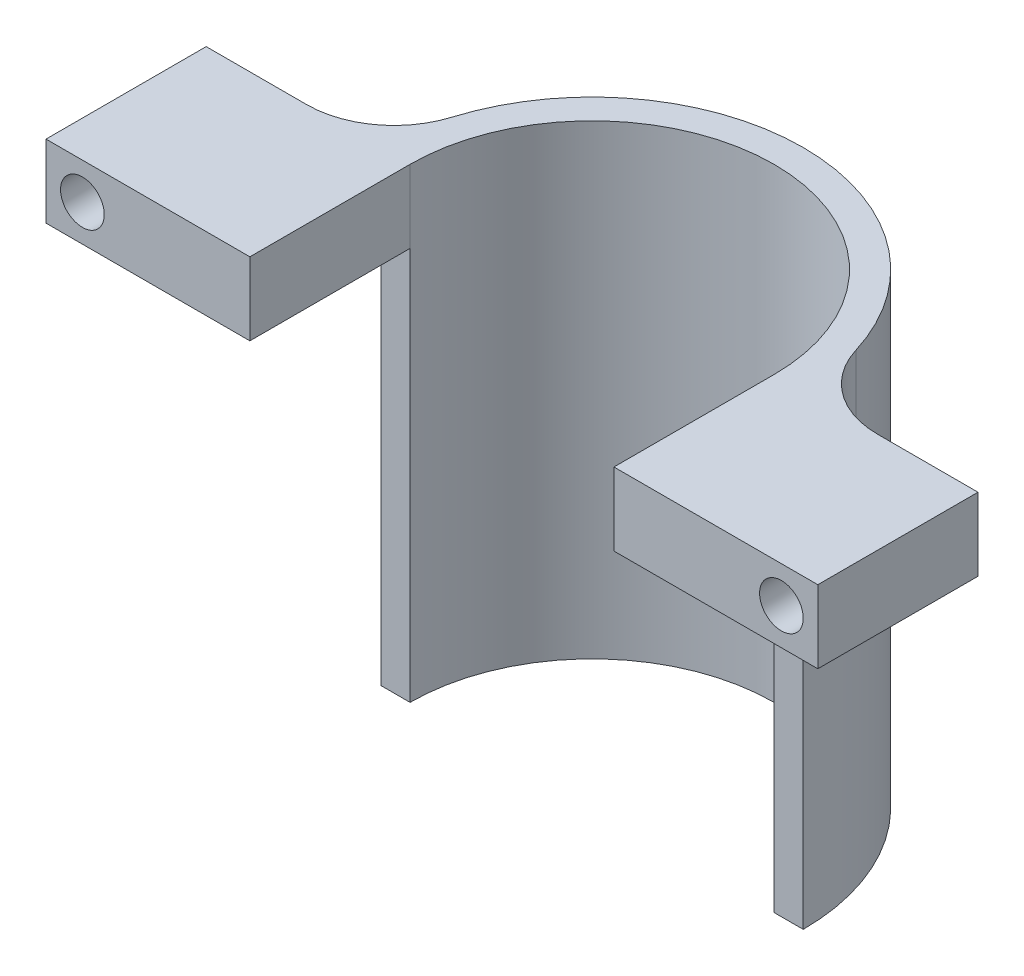
ISO-10303-21;
HEADER;
FILE_DESCRIPTION(('STEP AP214'),'2;1');
FILE_NAME('part.step','',(''),(''),'','','');
FILE_SCHEMA(('AUTOMOTIVE_DESIGN { 1 0 10303 214 1 1 1 1 }'));
ENDSEC;
DATA;
#1=APPLICATION_CONTEXT('core data for automotive mechanical design processes');
#2=APPLICATION_PROTOCOL_DEFINITION('international standard','automotive_design',2000,#1);
#3=PRODUCT_CONTEXT('',#1,'mechanical');
#4=PRODUCT('Part','Part','',(#3));
#5=PRODUCT_RELATED_PRODUCT_CATEGORY('part','',(#4));
#6=PRODUCT_DEFINITION_FORMATION('','',#4);
#7=PRODUCT_DEFINITION_CONTEXT('part definition',#1,'design');
#8=PRODUCT_DEFINITION('design','',#6,#7);
#9=PRODUCT_DEFINITION_SHAPE('','',#8);
#10=(LENGTH_UNIT() NAMED_UNIT(*) SI_UNIT(.MILLI.,.METRE.));
#11=(NAMED_UNIT(*) PLANE_ANGLE_UNIT() SI_UNIT($,.RADIAN.));
#12=(NAMED_UNIT(*) SI_UNIT($,.STERADIAN.) SOLID_ANGLE_UNIT());
#13=UNCERTAINTY_MEASURE_WITH_UNIT(LENGTH_MEASURE(1.E-05),#10,'distance_accuracy_value','');
#14=(GEOMETRIC_REPRESENTATION_CONTEXT(3) GLOBAL_UNCERTAINTY_ASSIGNED_CONTEXT((#13)) GLOBAL_UNIT_ASSIGNED_CONTEXT((#10,
#11,#12)) REPRESENTATION_CONTEXT('',''));
#15=CARTESIAN_POINT('',(0.,0.,0.));
#16=DIRECTION('',(0.,0.,1.));
#17=DIRECTION('',(1.,0.,0.));
#18=AXIS2_PLACEMENT_3D('',#15,#16,#17);
#19=CARTESIAN_POINT('',(12.5,32.,0.));
#20=DIRECTION('',(0.,0.,-1.));
#21=DIRECTION('',(-1.,0.,0.));
#22=AXIS2_PLACEMENT_3D('',#19,#20,#21);
#23=PLANE('',#22);
#24=DIRECTION('',(1.,0.,0.));
#25=VECTOR('',#24,1.);
#26=CARTESIAN_POINT('',(14.5,27.,0.));
#27=LINE('',#26,#25);
#28=CARTESIAN_POINT('',(12.5,27.,0.));
#29=VERTEX_POINT('',#28);
#30=CARTESIAN_POINT('',(14.5,27.,0.));
#31=VERTEX_POINT('',#30);
#32=EDGE_CURVE('E273',#29,#31,#27,.T.);
#33=ORIENTED_EDGE('',*,*,#32,.F.);
#34=DIRECTION('',(0.,-1.,0.));
#35=VECTOR('',#34,1.);
#36=CARTESIAN_POINT('',(12.5,32.,0.));
#37=LINE('',#36,#35);
#38=CARTESIAN_POINT('',(12.5,0.,0.));
#39=VERTEX_POINT('',#38);
#40=EDGE_CURVE('E223',#29,#39,#37,.T.);
#41=ORIENTED_EDGE('',*,*,#40,.T.);
#42=DIRECTION('',(1.,0.,0.));
#43=VECTOR('',#42,1.);
#44=CARTESIAN_POINT('',(12.5,0.,0.));
#45=LINE('',#44,#43);
#46=CARTESIAN_POINT('',(14.5,0.,0.));
#47=VERTEX_POINT('',#46);
#48=EDGE_CURVE('E208',#39,#47,#45,.T.);
#49=ORIENTED_EDGE('',*,*,#48,.T.);
#50=DIRECTION('',(0.,-1.,0.));
#51=VECTOR('',#50,1.);
#52=CARTESIAN_POINT('',(14.5,32.,0.));
#53=LINE('',#52,#51);
#54=EDGE_CURVE('E221',#31,#47,#53,.T.);
#55=ORIENTED_EDGE('',*,*,#54,.F.);
#56=EDGE_LOOP('',(#33,#41,#49,#55));
#57=FACE_BOUND('',#56,.T.);
#58=ADVANCED_FACE('F33',(#57),#23,.F.);
#59=CARTESIAN_POINT('',(-14.5,32.,0.));
#60=DIRECTION('',(0.,0.,-1.));
#61=DIRECTION('',(-1.,0.,0.));
#62=AXIS2_PLACEMENT_3D('',#59,#60,#61);
#63=PLANE('',#62);
#64=DIRECTION('',(1.,0.,0.));
#65=VECTOR('',#64,1.);
#66=CARTESIAN_POINT('',(-14.5,27.,0.));
#67=LINE('',#66,#65);
#68=CARTESIAN_POINT('',(-14.5,27.,0.));
#69=VERTEX_POINT('',#68);
#70=CARTESIAN_POINT('',(-12.5,27.,0.));
#71=VERTEX_POINT('',#70);
#72=EDGE_CURVE('E167',#69,#71,#67,.T.);
#73=ORIENTED_EDGE('',*,*,#72,.F.);
#74=DIRECTION('',(0.,-1.,0.));
#75=VECTOR('',#74,1.);
#76=CARTESIAN_POINT('',(-14.5,32.,0.));
#77=LINE('',#76,#75);
#78=CARTESIAN_POINT('',(-14.5,0.,0.));
#79=VERTEX_POINT('',#78);
#80=EDGE_CURVE('E219',#69,#79,#77,.T.);
#81=ORIENTED_EDGE('',*,*,#80,.T.);
#82=DIRECTION('',(1.,0.,0.));
#83=VECTOR('',#82,1.);
#84=CARTESIAN_POINT('',(-14.5,0.,0.));
#85=LINE('',#84,#83);
#86=CARTESIAN_POINT('',(-12.5,0.,0.));
#87=VERTEX_POINT('',#86);
#88=EDGE_CURVE('E202',#79,#87,#85,.T.);
#89=ORIENTED_EDGE('',*,*,#88,.T.);
#90=DIRECTION('',(0.,-1.,0.));
#91=VECTOR('',#90,1.);
#92=CARTESIAN_POINT('',(-12.5,32.,0.));
#93=LINE('',#92,#91);
#94=EDGE_CURVE('E205',#71,#87,#93,.T.);
#95=ORIENTED_EDGE('',*,*,#94,.F.);
#96=EDGE_LOOP('',(#73,#81,#89,#95));
#97=FACE_BOUND('',#96,.T.);
#98=ADVANCED_FACE('F308',(#97),#63,.F.);
#99=CARTESIAN_POINT('',(0.,32.,0.));
#100=DIRECTION('',(0.,-1.,0.));
#101=DIRECTION('',(0.,0.,-1.));
#102=AXIS2_PLACEMENT_3D('',#99,#100,#101);
#103=CYLINDRICAL_SURFACE('',#102,12.5);
#104=CARTESIAN_POINT('',(0.,0.,0.));
#105=DIRECTION('',(0.,-1.,0.));
#106=DIRECTION('',(0.,0.,1.));
#107=AXIS2_PLACEMENT_3D('',#104,#105,#106);
#108=CIRCLE('',#107,12.5);
#109=EDGE_CURVE('E199',#87,#39,#108,.T.);
#110=ORIENTED_EDGE('',*,*,#109,.T.);
#111=ORIENTED_EDGE('',*,*,#40,.F.);
#112=CARTESIAN_POINT('',(12.5,32.,0.));
#113=VERTEX_POINT('',#112);
#114=EDGE_CURVE('E224',#113,#29,#37,.T.);
#115=ORIENTED_EDGE('',*,*,#114,.F.);
#116=CARTESIAN_POINT('',(0.,32.,0.));
#117=DIRECTION('',(0.,-1.,0.));
#118=DIRECTION('',(0.,0.,1.));
#119=AXIS2_PLACEMENT_3D('',#116,#117,#118);
#120=CIRCLE('',#119,12.5);
#121=CARTESIAN_POINT('',(-12.5,32.,0.));
#122=VERTEX_POINT('',#121);
#123=EDGE_CURVE('E162',#122,#113,#120,.T.);
#124=ORIENTED_EDGE('',*,*,#123,.F.);
#125=EDGE_CURVE('E216',#122,#71,#93,.T.);
#126=ORIENTED_EDGE('',*,*,#125,.T.);
#127=ORIENTED_EDGE('',*,*,#94,.T.);
#128=EDGE_LOOP('',(#110,#111,#115,#124,#126,#127));
#129=FACE_BOUND('',#128,.T.);
#130=ADVANCED_FACE('F266',(#129),#103,.F.);
#131=CARTESIAN_POINT('',(0.,32.,0.));
#132=DIRECTION('',(0.,-1.,0.));
#133=DIRECTION('',(0.,0.,-1.));
#134=AXIS2_PLACEMENT_3D('',#131,#132,#133);
#135=CYLINDRICAL_SURFACE('',#134,14.5);
#136=CARTESIAN_POINT('',(0.,32.,0.));
#137=DIRECTION('',(0.,1.,0.));
#138=DIRECTION('',(0.,0.,1.));
#139=AXIS2_PLACEMENT_3D('',#136,#137,#138);
#140=CIRCLE('',#139,14.5);
#141=CARTESIAN_POINT('',(13.8650384813041,32.,-4.24390243902439));
#142=VERTEX_POINT('',#141);
#143=CARTESIAN_POINT('',(-13.8650384813041,32.,-4.24390243902439));
#144=VERTEX_POINT('',#143);
#145=EDGE_CURVE('E201',#142,#144,#140,.T.);
#146=ORIENTED_EDGE('',*,*,#145,.F.);
#147=DIRECTION('',(0.,-1.,0.));
#148=VECTOR('',#147,1.);
#149=CARTESIAN_POINT('',(13.8650384813041,32.,-4.24390243902439));
#150=LINE('',#149,#148);
#151=CARTESIAN_POINT('',(13.8650384813041,27.,-4.24390243902439));
#152=VERTEX_POINT('',#151);
#153=EDGE_CURVE('E231',#142,#152,#150,.T.);
#154=ORIENTED_EDGE('',*,*,#153,.T.);
#155=CARTESIAN_POINT('',(0.,27.,0.));
#156=DIRECTION('',(0.,1.,0.));
#157=DIRECTION('',(0.,0.,1.));
#158=AXIS2_PLACEMENT_3D('',#155,#156,#157);
#159=CIRCLE('',#158,14.5);
#160=EDGE_CURVE('E229',#152,#31,#159,.F.);
#161=ORIENTED_EDGE('',*,*,#160,.T.);
#162=ORIENTED_EDGE('',*,*,#54,.T.);
#163=CARTESIAN_POINT('',(0.,0.,0.));
#164=DIRECTION('',(0.,1.,0.));
#165=DIRECTION('',(0.,0.,1.));
#166=AXIS2_PLACEMENT_3D('',#163,#164,#165);
#167=CIRCLE('',#166,14.5);
#168=EDGE_CURVE('E211',#47,#79,#167,.T.);
#169=ORIENTED_EDGE('',*,*,#168,.T.);
#170=ORIENTED_EDGE('',*,*,#80,.F.);
#171=CARTESIAN_POINT('',(0.,27.,0.));
#172=DIRECTION('',(0.,1.,0.));
#173=DIRECTION('',(0.,0.,1.));
#174=AXIS2_PLACEMENT_3D('',#171,#172,#173);
#175=CIRCLE('',#174,14.5);
#176=CARTESIAN_POINT('',(-13.8650384813041,27.,-4.24390243902439));
#177=VERTEX_POINT('',#176);
#178=EDGE_CURVE('E48',#69,#177,#175,.F.);
#179=ORIENTED_EDGE('',*,*,#178,.T.);
#180=DIRECTION('',(0.,-1.,0.));
#181=VECTOR('',#180,1.);
#182=CARTESIAN_POINT('',(-13.8650384813041,32.,-4.24390243902439));
#183=LINE('',#182,#181);
#184=EDGE_CURVE('E226',#177,#144,#183,.F.);
#185=ORIENTED_EDGE('',*,*,#184,.T.);
#186=EDGE_LOOP('',(#146,#154,#161,#162,#169,#170,#179,#185));
#187=FACE_BOUND('',#186,.T.);
#188=ADVANCED_FACE('F244',(#187),#135,.T.);
#189=CARTESIAN_POINT('',(0.,32.,0.));
#190=DIRECTION('',(0.,1.,0.));
#191=DIRECTION('',(0.,0.,1.));
#192=AXIS2_PLACEMENT_3D('',#189,#190,#191);
#193=PLANE('',#192);
#194=ORIENTED_EDGE('',*,*,#123,.T.);
#195=DIRECTION('',(0.,0.,-1.));
#196=VECTOR('',#195,1.);
#197=CARTESIAN_POINT('',(12.5,32.,11.));
#198=LINE('',#197,#196);
#199=CARTESIAN_POINT('',(12.5,32.,11.));
#200=VERTEX_POINT('',#199);
#201=EDGE_CURVE('E142',#200,#113,#198,.T.);
#202=ORIENTED_EDGE('',*,*,#201,.F.);
#203=DIRECTION('',(-1.,0.,0.));
#204=VECTOR('',#203,1.);
#205=CARTESIAN_POINT('',(14.5,32.,11.));
#206=LINE('',#205,#204);
#207=CARTESIAN_POINT('',(26.5,32.,11.));
#208=VERTEX_POINT('',#207);
#209=EDGE_CURVE('E149',#208,#200,#206,.T.);
#210=ORIENTED_EDGE('',*,*,#209,.F.);
#211=DIRECTION('',(0.,0.,-1.));
#212=VECTOR('',#211,1.);
#213=CARTESIAN_POINT('',(26.5,32.,11.));
#214=LINE('',#213,#212);
#215=CARTESIAN_POINT('',(26.5,32.,0.));
#216=VERTEX_POINT('',#215);
#217=EDGE_CURVE('E288',#208,#216,#214,.T.);
#218=ORIENTED_EDGE('',*,*,#217,.T.);
#219=DIRECTION('',(-1.,0.,0.));
#220=VECTOR('',#219,1.);
#221=CARTESIAN_POINT('',(14.5,32.,0.));
#222=LINE('',#221,#220);
#223=CARTESIAN_POINT('',(19.6022957839127,32.,0.));
#224=VERTEX_POINT('',#223);
#225=EDGE_CURVE('E158',#216,#224,#222,.T.);
#226=ORIENTED_EDGE('',*,*,#225,.T.);
#227=CARTESIAN_POINT('',(19.6022957839127,32.,-6.));
#228=DIRECTION('',(0.,1.,0.));
#229=DIRECTION('',(0.,0.,1.));
#230=AXIS2_PLACEMENT_3D('',#227,#228,#229);
#231=CIRCLE('',#230,6.);
#232=EDGE_CURVE('E240',#224,#142,#231,.F.);
#233=ORIENTED_EDGE('',*,*,#232,.T.);
#234=ORIENTED_EDGE('',*,*,#145,.T.);
#235=CARTESIAN_POINT('',(-19.6022957839127,32.,-6.));
#236=DIRECTION('',(0.,1.,0.));
#237=DIRECTION('',(0.,0.,1.));
#238=AXIS2_PLACEMENT_3D('',#235,#236,#237);
#239=CIRCLE('',#238,6.);
#240=CARTESIAN_POINT('',(-19.6022957839127,32.,0.));
#241=VERTEX_POINT('',#240);
#242=EDGE_CURVE('E11',#144,#241,#239,.F.);
#243=ORIENTED_EDGE('',*,*,#242,.T.);
#244=DIRECTION('',(-1.,0.,0.));
#245=VECTOR('',#244,1.);
#246=CARTESIAN_POINT('',(-14.5,32.,0.));
#247=LINE('',#246,#245);
#248=CARTESIAN_POINT('',(-26.5,32.,0.));
#249=VERTEX_POINT('',#248);
#250=EDGE_CURVE('E177',#241,#249,#247,.T.);
#251=ORIENTED_EDGE('',*,*,#250,.T.);
#252=DIRECTION('',(0.,0.,-1.));
#253=VECTOR('',#252,1.);
#254=CARTESIAN_POINT('',(-26.5,32.,11.));
#255=LINE('',#254,#253);
#256=CARTESIAN_POINT('',(-26.5,32.,11.));
#257=VERTEX_POINT('',#256);
#258=EDGE_CURVE('E196',#257,#249,#255,.T.);
#259=ORIENTED_EDGE('',*,*,#258,.F.);
#260=DIRECTION('',(-1.,0.,0.));
#261=VECTOR('',#260,1.);
#262=CARTESIAN_POINT('',(-14.5,32.,11.));
#263=LINE('',#262,#261);
#264=CARTESIAN_POINT('',(-12.5,32.,11.));
#265=VERTEX_POINT('',#264);
#266=EDGE_CURVE('E173',#265,#257,#263,.T.);
#267=ORIENTED_EDGE('',*,*,#266,.F.);
#268=DIRECTION('',(0.,0.,-1.));
#269=VECTOR('',#268,1.);
#270=CARTESIAN_POINT('',(-12.5,32.,11.));
#271=LINE('',#270,#269);
#272=EDGE_CURVE('E183',#265,#122,#271,.T.);
#273=ORIENTED_EDGE('',*,*,#272,.T.);
#274=EDGE_LOOP('',(#194,#202,#210,#218,#226,#233,#234,#243,#251,#259,#267,#273));
#275=FACE_BOUND('',#274,.T.);
#276=ADVANCED_FACE('F160',(#275),#193,.T.);
#277=CARTESIAN_POINT('',(0.,0.,0.));
#278=DIRECTION('',(0.,1.,0.));
#279=DIRECTION('',(0.,0.,1.));
#280=AXIS2_PLACEMENT_3D('',#277,#278,#279);
#281=PLANE('',#280);
#282=ORIENTED_EDGE('',*,*,#109,.F.);
#283=ORIENTED_EDGE('',*,*,#88,.F.);
#284=ORIENTED_EDGE('',*,*,#168,.F.);
#285=ORIENTED_EDGE('',*,*,#48,.F.);
#286=EDGE_LOOP('',(#282,#283,#284,#285));
#287=FACE_BOUND('',#286,.T.);
#288=ADVANCED_FACE('F306',(#287),#281,.F.);
#289=CARTESIAN_POINT('',(0.,0.,0.));
#290=DIRECTION('',(0.,0.,1.));
#291=DIRECTION('',(1.,0.,0.));
#292=AXIS2_PLACEMENT_3D('',#289,#290,#291);
#293=PLANE('',#292);
#294=CARTESIAN_POINT('',(-24.,29.5,0.));
#295=DIRECTION('',(0.,0.,-1.));
#296=DIRECTION('',(-1.,0.,0.));
#297=AXIS2_PLACEMENT_3D('',#294,#295,#296);
#298=CIRCLE('',#297,1.5);
#299=CARTESIAN_POINT('',(-25.5,29.5,0.));
#300=VERTEX_POINT('',#299);
#301=EDGE_CURVE('E497',#300,#300,#298,.T.);
#302=ORIENTED_EDGE('',*,*,#301,.F.);
#303=EDGE_LOOP('',(#302));
#304=FACE_BOUND('',#303,.T.);
#305=ORIENTED_EDGE('',*,*,#250,.F.);
#306=DIRECTION('',(0.,1.,0.));
#307=VECTOR('',#306,1.);
#308=CARTESIAN_POINT('',(-19.6022957839127,27.,0.));
#309=LINE('',#308,#307);
#310=CARTESIAN_POINT('',(-19.6022957839127,27.,0.));
#311=VERTEX_POINT('',#310);
#312=EDGE_CURVE('E236',#241,#311,#309,.F.);
#313=ORIENTED_EDGE('',*,*,#312,.T.);
#314=CARTESIAN_POINT('',(-26.5,27.,0.));
#315=VERTEX_POINT('',#314);
#316=EDGE_CURVE('E185',#315,#311,#67,.T.);
#317=ORIENTED_EDGE('',*,*,#316,.F.);
#318=DIRECTION('',(0.,-1.,0.));
#319=VECTOR('',#318,1.);
#320=CARTESIAN_POINT('',(-26.5,32.,0.));
#321=LINE('',#320,#319);
#322=EDGE_CURVE('E164',#249,#315,#321,.T.);
#323=ORIENTED_EDGE('',*,*,#322,.F.);
#324=EDGE_LOOP('',(#305,#313,#317,#323));
#325=FACE_BOUND('',#324,.T.);
#326=ADVANCED_FACE('F251',(#304,#325),#293,.F.);
#327=CARTESIAN_POINT('',(-26.5,32.,11.));
#328=DIRECTION('',(1.,0.,0.));
#329=DIRECTION('',(0.,0.,-1.));
#330=AXIS2_PLACEMENT_3D('',#327,#328,#329);
#331=PLANE('',#330);
#332=ORIENTED_EDGE('',*,*,#322,.T.);
#333=DIRECTION('',(0.,0.,-1.));
#334=VECTOR('',#333,1.);
#335=CARTESIAN_POINT('',(-26.5,27.,11.));
#336=LINE('',#335,#334);
#337=CARTESIAN_POINT('',(-26.5,27.,11.));
#338=VERTEX_POINT('',#337);
#339=EDGE_CURVE('E193',#338,#315,#336,.T.);
#340=ORIENTED_EDGE('',*,*,#339,.F.);
#341=DIRECTION('',(0.,-1.,0.));
#342=VECTOR('',#341,1.);
#343=CARTESIAN_POINT('',(-26.5,32.,11.));
#344=LINE('',#343,#342);
#345=EDGE_CURVE('E176',#257,#338,#344,.T.);
#346=ORIENTED_EDGE('',*,*,#345,.F.);
#347=ORIENTED_EDGE('',*,*,#258,.T.);
#348=EDGE_LOOP('',(#332,#340,#346,#347));
#349=FACE_BOUND('',#348,.T.);
#350=ADVANCED_FACE('F254',(#349),#331,.F.);
#351=CARTESIAN_POINT('',(-14.5,27.,11.));
#352=DIRECTION('',(0.,1.,0.));
#353=DIRECTION('',(0.,0.,1.));
#354=AXIS2_PLACEMENT_3D('',#351,#352,#353);
#355=PLANE('',#354);
#356=ORIENTED_EDGE('',*,*,#316,.T.);
#357=CARTESIAN_POINT('',(-19.6022957839127,27.,-6.));
#358=DIRECTION('',(0.,1.,0.));
#359=DIRECTION('',(0.,0.,1.));
#360=AXIS2_PLACEMENT_3D('',#357,#358,#359);
#361=CIRCLE('',#360,6.);
#362=EDGE_CURVE('E41',#311,#177,#361,.T.);
#363=ORIENTED_EDGE('',*,*,#362,.T.);
#364=ORIENTED_EDGE('',*,*,#178,.F.);
#365=ORIENTED_EDGE('',*,*,#72,.T.);
#366=DIRECTION('',(0.,0.,-1.));
#367=VECTOR('',#366,1.);
#368=CARTESIAN_POINT('',(-12.5,27.,11.));
#369=LINE('',#368,#367);
#370=CARTESIAN_POINT('',(-12.5,27.,11.));
#371=VERTEX_POINT('',#370);
#372=EDGE_CURVE('E190',#371,#71,#369,.T.);
#373=ORIENTED_EDGE('',*,*,#372,.F.);
#374=DIRECTION('',(1.,0.,0.));
#375=VECTOR('',#374,1.);
#376=CARTESIAN_POINT('',(-14.5,27.,11.));
#377=LINE('',#376,#375);
#378=EDGE_CURVE('E179',#338,#371,#377,.T.);
#379=ORIENTED_EDGE('',*,*,#378,.F.);
#380=ORIENTED_EDGE('',*,*,#339,.T.);
#381=EDGE_LOOP('',(#356,#363,#364,#365,#373,#379,#380));
#382=FACE_BOUND('',#381,.T.);
#383=ADVANCED_FACE('F241',(#382),#355,.F.);
#384=CARTESIAN_POINT('',(-12.5,32.,11.));
#385=DIRECTION('',(-1.,0.,0.));
#386=DIRECTION('',(0.,0.,1.));
#387=AXIS2_PLACEMENT_3D('',#384,#385,#386);
#388=PLANE('',#387);
#389=ORIENTED_EDGE('',*,*,#125,.F.);
#390=ORIENTED_EDGE('',*,*,#272,.F.);
#391=DIRECTION('',(0.,1.,0.));
#392=VECTOR('',#391,1.);
#393=CARTESIAN_POINT('',(-12.5,32.,11.));
#394=LINE('',#393,#392);
#395=EDGE_CURVE('E181',#371,#265,#394,.T.);
#396=ORIENTED_EDGE('',*,*,#395,.F.);
#397=ORIENTED_EDGE('',*,*,#372,.T.);
#398=EDGE_LOOP('',(#389,#390,#396,#397));
#399=FACE_BOUND('',#398,.T.);
#400=ADVANCED_FACE('F263',(#399),#388,.F.);
#401=CARTESIAN_POINT('',(0.,0.,11.));
#402=DIRECTION('',(0.,0.,1.));
#403=DIRECTION('',(1.,0.,0.));
#404=AXIS2_PLACEMENT_3D('',#401,#402,#403);
#405=PLANE('',#404);
#406=CARTESIAN_POINT('',(-24.,29.5,11.));
#407=DIRECTION('',(0.,0.,-1.));
#408=DIRECTION('',(-1.,0.,0.));
#409=AXIS2_PLACEMENT_3D('',#406,#407,#408);
#410=CIRCLE('',#409,1.5);
#411=CARTESIAN_POINT('',(-25.5,29.5,11.));
#412=VERTEX_POINT('',#411);
#413=EDGE_CURVE('E282',#412,#412,#410,.T.);
#414=ORIENTED_EDGE('',*,*,#413,.T.);
#415=EDGE_LOOP('',(#414));
#416=FACE_BOUND('',#415,.T.);
#417=ORIENTED_EDGE('',*,*,#266,.T.);
#418=ORIENTED_EDGE('',*,*,#345,.T.);
#419=ORIENTED_EDGE('',*,*,#378,.T.);
#420=ORIENTED_EDGE('',*,*,#395,.T.);
#421=EDGE_LOOP('',(#417,#418,#419,#420));
#422=FACE_BOUND('',#421,.T.);
#423=ADVANCED_FACE('F259',(#416,#422),#405,.T.);
#424=CARTESIAN_POINT('',(0.,0.,0.));
#425=DIRECTION('',(0.,0.,1.));
#426=DIRECTION('',(1.,0.,0.));
#427=AXIS2_PLACEMENT_3D('',#424,#425,#426);
#428=PLANE('',#427);
#429=CARTESIAN_POINT('',(24.,29.5,0.));
#430=DIRECTION('',(0.,0.,-1.));
#431=DIRECTION('',(1.,0.,0.));
#432=AXIS2_PLACEMENT_3D('',#429,#430,#431);
#433=CIRCLE('',#432,1.5);
#434=CARTESIAN_POINT('',(25.5,29.5,0.));
#435=VERTEX_POINT('',#434);
#436=EDGE_CURVE('E503',#435,#435,#433,.T.);
#437=ORIENTED_EDGE('',*,*,#436,.F.);
#438=EDGE_LOOP('',(#437));
#439=FACE_BOUND('',#438,.T.);
#440=CARTESIAN_POINT('',(19.6022957839127,27.,0.));
#441=VERTEX_POINT('',#440);
#442=CARTESIAN_POINT('',(26.5,27.,0.));
#443=VERTEX_POINT('',#442);
#444=EDGE_CURVE('E279',#441,#443,#27,.T.);
#445=ORIENTED_EDGE('',*,*,#444,.F.);
#446=DIRECTION('',(0.,1.,0.));
#447=VECTOR('',#446,1.);
#448=CARTESIAN_POINT('',(19.6022957839127,32.,0.));
#449=LINE('',#448,#447);
#450=EDGE_CURVE('E234',#441,#224,#449,.T.);
#451=ORIENTED_EDGE('',*,*,#450,.T.);
#452=ORIENTED_EDGE('',*,*,#225,.F.);
#453=DIRECTION('',(0.,1.,0.));
#454=VECTOR('',#453,1.);
#455=CARTESIAN_POINT('',(26.5,32.,0.));
#456=LINE('',#455,#454);
#457=EDGE_CURVE('E278',#443,#216,#456,.T.);
#458=ORIENTED_EDGE('',*,*,#457,.F.);
#459=EDGE_LOOP('',(#445,#451,#452,#458));
#460=FACE_BOUND('',#459,.T.);
#461=ADVANCED_FACE('F296',(#439,#460),#428,.F.);
#462=CARTESIAN_POINT('',(12.5,32.,11.));
#463=DIRECTION('',(1.,0.,0.));
#464=DIRECTION('',(0.,0.,-1.));
#465=AXIS2_PLACEMENT_3D('',#462,#463,#464);
#466=PLANE('',#465);
#467=ORIENTED_EDGE('',*,*,#114,.T.);
#468=DIRECTION('',(0.,0.,-1.));
#469=VECTOR('',#468,1.);
#470=CARTESIAN_POINT('',(12.5,27.,11.));
#471=LINE('',#470,#469);
#472=CARTESIAN_POINT('',(12.5,27.,11.));
#473=VERTEX_POINT('',#472);
#474=EDGE_CURVE('E145',#473,#29,#471,.T.);
#475=ORIENTED_EDGE('',*,*,#474,.F.);
#476=DIRECTION('',(0.,-1.,0.));
#477=VECTOR('',#476,1.);
#478=CARTESIAN_POINT('',(12.5,32.,11.));
#479=LINE('',#478,#477);
#480=EDGE_CURVE('E138',#200,#473,#479,.T.);
#481=ORIENTED_EDGE('',*,*,#480,.F.);
#482=ORIENTED_EDGE('',*,*,#201,.T.);
#483=EDGE_LOOP('',(#467,#475,#481,#482));
#484=FACE_BOUND('',#483,.T.);
#485=ADVANCED_FACE('F140',(#484),#466,.F.);
#486=CARTESIAN_POINT('',(14.5,27.,11.));
#487=DIRECTION('',(0.,1.,0.));
#488=DIRECTION('',(0.,0.,1.));
#489=AXIS2_PLACEMENT_3D('',#486,#487,#488);
#490=PLANE('',#489);
#491=ORIENTED_EDGE('',*,*,#32,.T.);
#492=ORIENTED_EDGE('',*,*,#160,.F.);
#493=CARTESIAN_POINT('',(19.6022957839127,27.,-6.));
#494=DIRECTION('',(0.,1.,0.));
#495=DIRECTION('',(0.,0.,1.));
#496=AXIS2_PLACEMENT_3D('',#493,#494,#495);
#497=CIRCLE('',#496,6.);
#498=EDGE_CURVE('E238',#152,#441,#497,.T.);
#499=ORIENTED_EDGE('',*,*,#498,.T.);
#500=ORIENTED_EDGE('',*,*,#444,.T.);
#501=DIRECTION('',(0.,0.,-1.));
#502=VECTOR('',#501,1.);
#503=CARTESIAN_POINT('',(26.5,27.,11.));
#504=LINE('',#503,#502);
#505=CARTESIAN_POINT('',(26.5,27.,11.));
#506=VERTEX_POINT('',#505);
#507=EDGE_CURVE('E169',#506,#443,#504,.T.);
#508=ORIENTED_EDGE('',*,*,#507,.F.);
#509=DIRECTION('',(1.,0.,0.));
#510=VECTOR('',#509,1.);
#511=CARTESIAN_POINT('',(14.5,27.,11.));
#512=LINE('',#511,#510);
#513=EDGE_CURVE('E148',#473,#506,#512,.T.);
#514=ORIENTED_EDGE('',*,*,#513,.F.);
#515=ORIENTED_EDGE('',*,*,#474,.T.);
#516=EDGE_LOOP('',(#491,#492,#499,#500,#508,#514,#515));
#517=FACE_BOUND('',#516,.T.);
#518=ADVANCED_FACE('F271',(#517),#490,.F.);
#519=CARTESIAN_POINT('',(26.5,32.,11.));
#520=DIRECTION('',(-1.,0.,0.));
#521=DIRECTION('',(0.,0.,1.));
#522=AXIS2_PLACEMENT_3D('',#519,#520,#521);
#523=PLANE('',#522);
#524=ORIENTED_EDGE('',*,*,#457,.T.);
#525=ORIENTED_EDGE('',*,*,#217,.F.);
#526=DIRECTION('',(0.,1.,0.));
#527=VECTOR('',#526,1.);
#528=CARTESIAN_POINT('',(26.5,32.,11.));
#529=LINE('',#528,#527);
#530=EDGE_CURVE('E154',#506,#208,#529,.T.);
#531=ORIENTED_EDGE('',*,*,#530,.F.);
#532=ORIENTED_EDGE('',*,*,#507,.T.);
#533=EDGE_LOOP('',(#524,#525,#531,#532));
#534=FACE_BOUND('',#533,.T.);
#535=ADVANCED_FACE('F292',(#534),#523,.F.);
#536=CARTESIAN_POINT('',(0.,0.,11.));
#537=DIRECTION('',(0.,0.,1.));
#538=DIRECTION('',(1.,0.,0.));
#539=AXIS2_PLACEMENT_3D('',#536,#537,#538);
#540=PLANE('',#539);
#541=CARTESIAN_POINT('',(24.,29.5,11.));
#542=DIRECTION('',(0.,0.,-1.));
#543=DIRECTION('',(1.,0.,0.));
#544=AXIS2_PLACEMENT_3D('',#541,#542,#543);
#545=CIRCLE('',#544,1.5);
#546=CARTESIAN_POINT('',(25.5,29.5,11.));
#547=VERTEX_POINT('',#546);
#548=EDGE_CURVE('E498',#547,#547,#545,.T.);
#549=ORIENTED_EDGE('',*,*,#548,.T.);
#550=EDGE_LOOP('',(#549));
#551=FACE_BOUND('',#550,.T.);
#552=ORIENTED_EDGE('',*,*,#209,.T.);
#553=ORIENTED_EDGE('',*,*,#480,.T.);
#554=ORIENTED_EDGE('',*,*,#513,.T.);
#555=ORIENTED_EDGE('',*,*,#530,.T.);
#556=EDGE_LOOP('',(#552,#553,#554,#555));
#557=FACE_BOUND('',#556,.T.);
#558=ADVANCED_FACE('F152',(#551,#557),#540,.T.);
#559=CARTESIAN_POINT('',(24.,29.5,11.));
#560=DIRECTION('',(0.,0.,-1.));
#561=DIRECTION('',(-1.,0.,0.));
#562=AXIS2_PLACEMENT_3D('',#559,#560,#561);
#563=CYLINDRICAL_SURFACE('',#562,1.5);
#564=ORIENTED_EDGE('',*,*,#548,.F.);
#565=EDGE_LOOP('',(#564));
#566=FACE_BOUND('',#565,.T.);
#567=ORIENTED_EDGE('',*,*,#436,.T.);
#568=EDGE_LOOP('',(#567));
#569=FACE_BOUND('',#568,.T.);
#570=ADVANCED_FACE('F327',(#566,#569),#563,.F.);
#571=CARTESIAN_POINT('',(-24.,29.5,11.));
#572=DIRECTION('',(0.,0.,-1.));
#573=DIRECTION('',(-1.,0.,0.));
#574=AXIS2_PLACEMENT_3D('',#571,#572,#573);
#575=CYLINDRICAL_SURFACE('',#574,1.5);
#576=ORIENTED_EDGE('',*,*,#413,.F.);
#577=EDGE_LOOP('',(#576));
#578=FACE_BOUND('',#577,.T.);
#579=ORIENTED_EDGE('',*,*,#301,.T.);
#580=EDGE_LOOP('',(#579));
#581=FACE_BOUND('',#580,.T.);
#582=ADVANCED_FACE('F322',(#578,#581),#575,.F.);
#583=CARTESIAN_POINT('',(19.6022957839127,32.,-6.));
#584=DIRECTION('',(0.,-1.,0.));
#585=DIRECTION('',(0.,0.,-1.));
#586=AXIS2_PLACEMENT_3D('',#583,#584,#585);
#587=CYLINDRICAL_SURFACE('',#586,6.);
#588=ORIENTED_EDGE('',*,*,#232,.F.);
#589=ORIENTED_EDGE('',*,*,#450,.F.);
#590=ORIENTED_EDGE('',*,*,#498,.F.);
#591=ORIENTED_EDGE('',*,*,#153,.F.);
#592=EDGE_LOOP('',(#588,#589,#590,#591));
#593=FACE_BOUND('',#592,.T.);
#594=ADVANCED_FACE('F301',(#593),#587,.F.);
#595=CARTESIAN_POINT('',(-19.6022957839127,32.,-6.));
#596=DIRECTION('',(0.,-1.,0.));
#597=DIRECTION('',(0.,0.,-1.));
#598=AXIS2_PLACEMENT_3D('',#595,#596,#597);
#599=CYLINDRICAL_SURFACE('',#598,6.);
#600=ORIENTED_EDGE('',*,*,#242,.F.);
#601=ORIENTED_EDGE('',*,*,#184,.F.);
#602=ORIENTED_EDGE('',*,*,#362,.F.);
#603=ORIENTED_EDGE('',*,*,#312,.F.);
#604=EDGE_LOOP('',(#600,#601,#602,#603));
#605=FACE_BOUND('',#604,.T.);
#606=ADVANCED_FACE('F35',(#605),#599,.F.);
#607=CLOSED_SHELL('',(#58,#98,#130,#188,#276,#288,#326,#350,#383,#400,#423,#461,#485,#518,#535,
#558,#570,#582,#594,#606));
#608=MANIFOLD_SOLID_BREP('B2',#607);
#609=ADVANCED_BREP_SHAPE_REPRESENTATION('',(#18,#608),#14);
#610=SHAPE_DEFINITION_REPRESENTATION(#9,#609);
ENDSEC;
END-ISO-10303-21;
